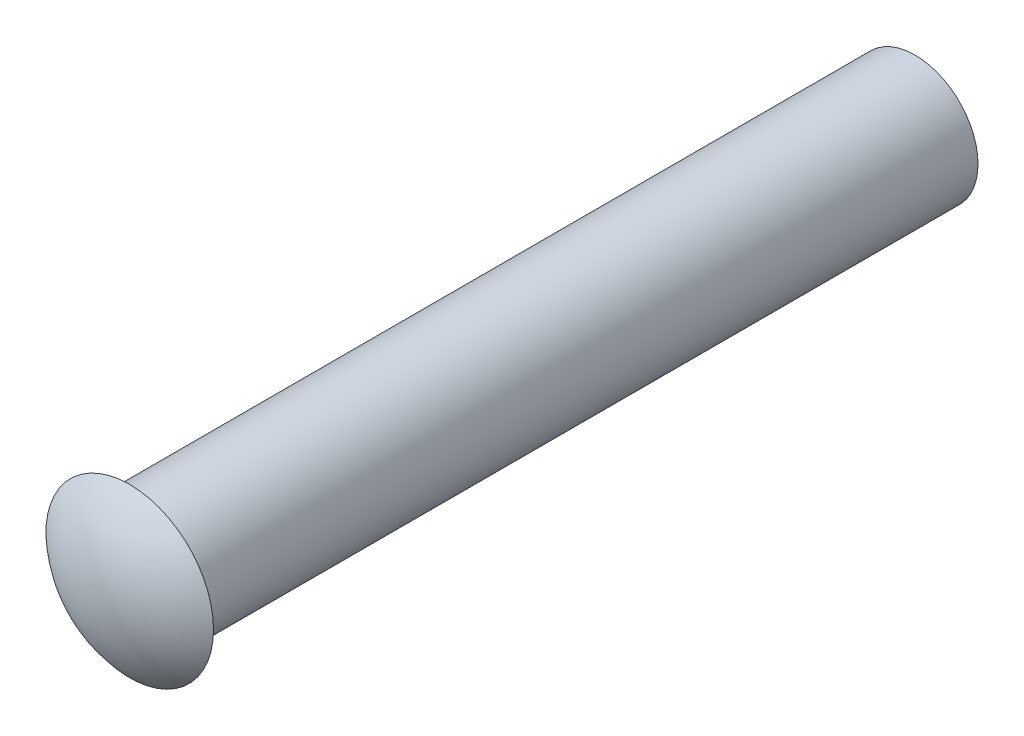
ISO-10303-21;
HEADER;
FILE_DESCRIPTION(('STEP AP214'),'2;1');
FILE_NAME('part.step','',(''),(''),'','','');
FILE_SCHEMA(('AUTOMOTIVE_DESIGN { 1 0 10303 214 1 1 1 1 }'));
ENDSEC;
DATA;
#1=APPLICATION_CONTEXT('core data for automotive mechanical design processes');
#2=APPLICATION_PROTOCOL_DEFINITION('international standard','automotive_design',2000,#1);
#3=PRODUCT_CONTEXT('',#1,'mechanical');
#4=PRODUCT('Part','Part','',(#3));
#5=PRODUCT_RELATED_PRODUCT_CATEGORY('part','',(#4));
#6=PRODUCT_DEFINITION_FORMATION('','',#4);
#7=PRODUCT_DEFINITION_CONTEXT('part definition',#1,'design');
#8=PRODUCT_DEFINITION('design','',#6,#7);
#9=PRODUCT_DEFINITION_SHAPE('','',#8);
#10=(LENGTH_UNIT() NAMED_UNIT(*) SI_UNIT(.MILLI.,.METRE.));
#11=(NAMED_UNIT(*) PLANE_ANGLE_UNIT() SI_UNIT($,.RADIAN.));
#12=(NAMED_UNIT(*) SI_UNIT($,.STERADIAN.) SOLID_ANGLE_UNIT());
#13=UNCERTAINTY_MEASURE_WITH_UNIT(LENGTH_MEASURE(1.E-05),#10,'distance_accuracy_value','');
#14=(GEOMETRIC_REPRESENTATION_CONTEXT(3) GLOBAL_UNCERTAINTY_ASSIGNED_CONTEXT((#13)) GLOBAL_UNIT_ASSIGNED_CONTEXT((#10,
#11,#12)) REPRESENTATION_CONTEXT('',''));
#15=CARTESIAN_POINT('',(0.,0.,0.));
#16=DIRECTION('',(0.,0.,1.));
#17=DIRECTION('',(1.,0.,0.));
#18=AXIS2_PLACEMENT_3D('',#15,#16,#17);
#19=CARTESIAN_POINT('',(0.,0.,-3.09033333333333));
#20=DIRECTION('',(0.,0.,1.));
#21=DIRECTION('',(0.,1.,0.));
#22=AXIS2_PLACEMENT_3D('',#19,#20,#21);
#23=SPHERICAL_SURFACE('',#22,3.09033333333333);
#24=CARTESIAN_POINT('',(0.,0.,-0.762));
#25=DIRECTION('',(0.,0.,1.));
#26=DIRECTION('',(1.,0.,0.));
#27=AXIS2_PLACEMENT_3D('',#24,#25,#26);
#28=CIRCLE('',#27,2.032);
#29=CARTESIAN_POINT('',(2.032,0.,-0.762));
#30=VERTEX_POINT('',#29);
#31=EDGE_CURVE('E10',#30,#30,#28,.T.);
#32=ORIENTED_EDGE('',*,*,#31,.T.);
#33=EDGE_LOOP('',(#32));
#34=FACE_BOUND('',#33,.T.);
#35=ADVANCED_FACE('F37',(#34),#23,.T.);
#36=CARTESIAN_POINT('',(0.,1.524,-0.762));
#37=DIRECTION('',(0.,0.,1.));
#38=DIRECTION('',(1.,0.,0.));
#39=AXIS2_PLACEMENT_3D('',#36,#37,#38);
#40=PLANE('',#39);
#41=ORIENTED_EDGE('',*,*,#31,.F.);
#42=EDGE_LOOP('',(#41));
#43=FACE_BOUND('',#42,.T.);
#44=CARTESIAN_POINT('',(0.,0.,-0.762));
#45=DIRECTION('',(0.,0.,1.));
#46=DIRECTION('',(1.,0.,0.));
#47=AXIS2_PLACEMENT_3D('',#44,#45,#46);
#48=CIRCLE('',#47,1.524);
#49=CARTESIAN_POINT('',(1.524,0.,-0.762));
#50=VERTEX_POINT('',#49);
#51=EDGE_CURVE('E43',#50,#50,#48,.T.);
#52=ORIENTED_EDGE('',*,*,#51,.T.);
#53=EDGE_LOOP('',(#52));
#54=FACE_BOUND('',#53,.T.);
#55=ADVANCED_FACE('F62',(#43,#54),#40,.F.);
#56=CARTESIAN_POINT('',(0.,0.,0.));
#57=DIRECTION('',(0.,0.,1.));
#58=DIRECTION('',(1.,0.,0.));
#59=AXIS2_PLACEMENT_3D('',#56,#57,#58);
#60=CYLINDRICAL_SURFACE('',#59,1.524);
#61=ORIENTED_EDGE('',*,*,#51,.F.);
#62=EDGE_LOOP('',(#61));
#63=FACE_BOUND('',#62,.T.);
#64=CARTESIAN_POINT('',(0.,0.,-19.812));
#65=DIRECTION('',(0.,0.,1.));
#66=DIRECTION('',(1.,0.,0.));
#67=AXIS2_PLACEMENT_3D('',#64,#65,#66);
#68=CIRCLE('',#67,1.524);
#69=CARTESIAN_POINT('',(1.524,0.,-19.812));
#70=VERTEX_POINT('',#69);
#71=EDGE_CURVE('E47',#70,#70,#68,.T.);
#72=ORIENTED_EDGE('',*,*,#71,.T.);
#73=EDGE_LOOP('',(#72));
#74=FACE_BOUND('',#73,.T.);
#75=ADVANCED_FACE('F54',(#63,#74),#60,.T.);
#76=CARTESIAN_POINT('',(0.,0.,-19.812));
#77=DIRECTION('',(0.,0.,1.));
#78=DIRECTION('',(1.,0.,0.));
#79=AXIS2_PLACEMENT_3D('',#76,#77,#78);
#80=PLANE('',#79);
#81=ORIENTED_EDGE('',*,*,#71,.F.);
#82=EDGE_LOOP('',(#81));
#83=FACE_BOUND('',#82,.T.);
#84=ADVANCED_FACE('F56',(#83),#80,.F.);
#85=CLOSED_SHELL('',(#35,#55,#75,#84));
#86=MANIFOLD_SOLID_BREP('B2',#85);
#87=ADVANCED_BREP_SHAPE_REPRESENTATION('',(#18,#86),#14);
#88=SHAPE_DEFINITION_REPRESENTATION(#9,#87);
ENDSEC;
END-ISO-10303-21;
